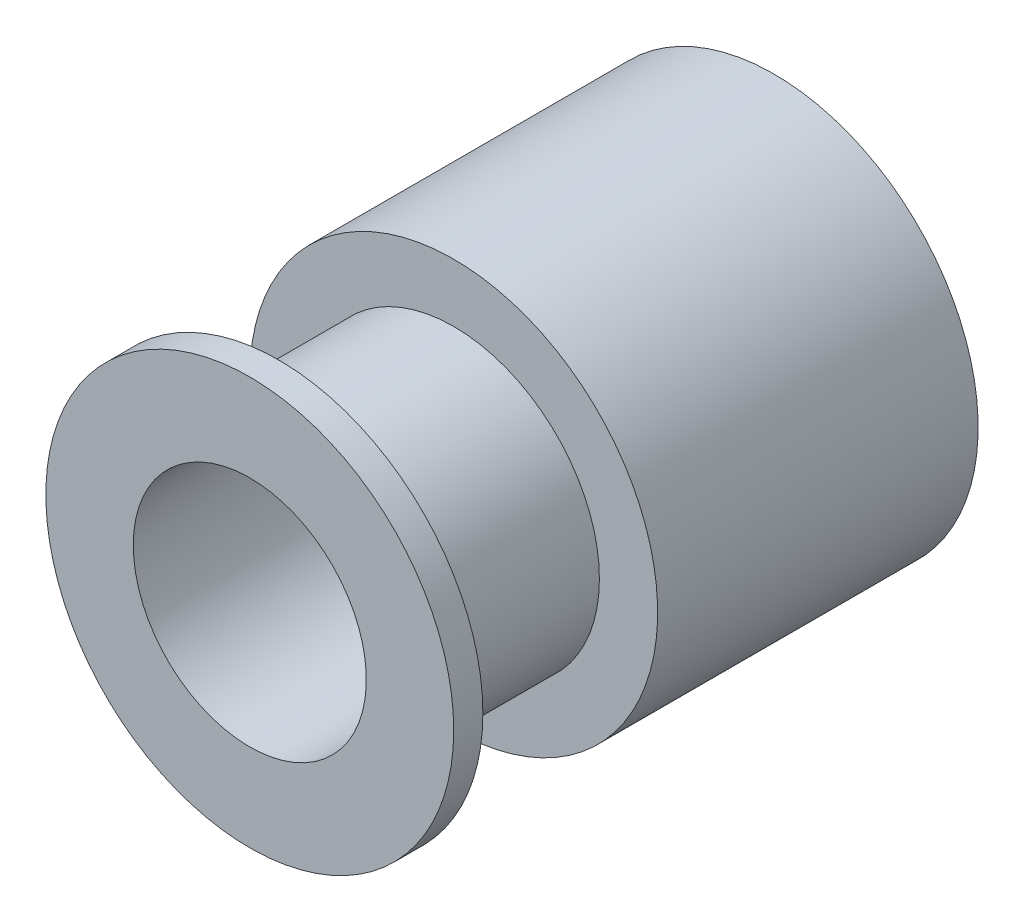
ISO-10303-21;
HEADER;
FILE_DESCRIPTION(('STEP AP214'),'2;1');
FILE_NAME('part.step','',(''),(''),'','','');
FILE_SCHEMA(('AUTOMOTIVE_DESIGN { 1 0 10303 214 1 1 1 1 }'));
ENDSEC;
DATA;
#1=APPLICATION_CONTEXT('core data for automotive mechanical design processes');
#2=APPLICATION_PROTOCOL_DEFINITION('international standard','automotive_design',2000,#1);
#3=PRODUCT_CONTEXT('',#1,'mechanical');
#4=PRODUCT('Part','Part','',(#3));
#5=PRODUCT_RELATED_PRODUCT_CATEGORY('part','',(#4));
#6=PRODUCT_DEFINITION_FORMATION('','',#4);
#7=PRODUCT_DEFINITION_CONTEXT('part definition',#1,'design');
#8=PRODUCT_DEFINITION('design','',#6,#7);
#9=PRODUCT_DEFINITION_SHAPE('','',#8);
#10=(LENGTH_UNIT() NAMED_UNIT(*) SI_UNIT(.MILLI.,.METRE.));
#11=(NAMED_UNIT(*) PLANE_ANGLE_UNIT() SI_UNIT($,.RADIAN.));
#12=(NAMED_UNIT(*) SI_UNIT($,.STERADIAN.) SOLID_ANGLE_UNIT());
#13=UNCERTAINTY_MEASURE_WITH_UNIT(LENGTH_MEASURE(1.E-05),#10,'distance_accuracy_value','');
#14=(GEOMETRIC_REPRESENTATION_CONTEXT(3) GLOBAL_UNCERTAINTY_ASSIGNED_CONTEXT((#13)) GLOBAL_UNIT_ASSIGNED_CONTEXT((#10,
#11,#12)) REPRESENTATION_CONTEXT('',''));
#15=CARTESIAN_POINT('',(0.,0.,0.));
#16=DIRECTION('',(0.,0.,1.));
#17=DIRECTION('',(1.,0.,0.));
#18=AXIS2_PLACEMENT_3D('',#15,#16,#17);
#19=CARTESIAN_POINT('',(0.,0.,1.));
#20=DIRECTION('',(0.,0.,-1.));
#21=DIRECTION('',(-1.,0.,0.));
#22=AXIS2_PLACEMENT_3D('',#19,#20,#21);
#23=CYLINDRICAL_SURFACE('',#22,7.);
#24=CARTESIAN_POINT('',(0.,0.,1.));
#25=DIRECTION('',(0.,0.,1.));
#26=DIRECTION('',(1.,0.,0.));
#27=AXIS2_PLACEMENT_3D('',#24,#25,#26);
#28=CIRCLE('',#27,7.);
#29=CARTESIAN_POINT('',(7.,0.,1.));
#30=VERTEX_POINT('',#29);
#31=EDGE_CURVE('E39',#30,#30,#28,.T.);
#32=ORIENTED_EDGE('',*,*,#31,.F.);
#33=EDGE_LOOP('',(#32));
#34=FACE_BOUND('',#33,.T.);
#35=CARTESIAN_POINT('',(0.,0.,0.));
#36=DIRECTION('',(0.,0.,1.));
#37=DIRECTION('',(1.,0.,0.));
#38=AXIS2_PLACEMENT_3D('',#35,#36,#37);
#39=CIRCLE('',#38,7.);
#40=CARTESIAN_POINT('',(7.,0.,0.));
#41=VERTEX_POINT('',#40);
#42=EDGE_CURVE('E43',#41,#41,#39,.T.);
#43=ORIENTED_EDGE('',*,*,#42,.T.);
#44=EDGE_LOOP('',(#43));
#45=FACE_BOUND('',#44,.T.);
#46=ADVANCED_FACE('F33',(#34,#45),#23,.T.);
#47=CARTESIAN_POINT('',(0.,0.,1.));
#48=DIRECTION('',(0.,0.,1.));
#49=DIRECTION('',(1.,0.,0.));
#50=AXIS2_PLACEMENT_3D('',#47,#48,#49);
#51=PLANE('',#50);
#52=CARTESIAN_POINT('',(0.,0.,1.));
#53=DIRECTION('',(0.,0.,-1.));
#54=DIRECTION('',(-1.,0.,0.));
#55=AXIS2_PLACEMENT_3D('',#52,#53,#54);
#56=CIRCLE('',#55,4.);
#57=CARTESIAN_POINT('',(-4.,0.,1.));
#58=VERTEX_POINT('',#57);
#59=EDGE_CURVE('E56',#58,#58,#56,.T.);
#60=ORIENTED_EDGE('',*,*,#59,.T.);
#61=EDGE_LOOP('',(#60));
#62=FACE_BOUND('',#61,.T.);
#63=ORIENTED_EDGE('',*,*,#31,.T.);
#64=EDGE_LOOP('',(#63));
#65=FACE_BOUND('',#64,.T.);
#66=ADVANCED_FACE('F65',(#62,#65),#51,.T.);
#67=CARTESIAN_POINT('',(0.,0.,0.));
#68=DIRECTION('',(0.,0.,1.));
#69=DIRECTION('',(1.,0.,0.));
#70=AXIS2_PLACEMENT_3D('',#67,#68,#69);
#71=PLANE('',#70);
#72=CARTESIAN_POINT('',(0.,0.,0.));
#73=DIRECTION('',(0.,0.,1.));
#74=DIRECTION('',(1.,0.,0.));
#75=AXIS2_PLACEMENT_3D('',#72,#73,#74);
#76=CIRCLE('',#75,5.);
#77=CARTESIAN_POINT('',(5.,0.,0.));
#78=VERTEX_POINT('',#77);
#79=EDGE_CURVE('E10',#78,#78,#76,.F.);
#80=ORIENTED_EDGE('',*,*,#79,.F.);
#81=EDGE_LOOP('',(#80));
#82=FACE_BOUND('',#81,.T.);
#83=ORIENTED_EDGE('',*,*,#42,.F.);
#84=EDGE_LOOP('',(#83));
#85=FACE_BOUND('',#84,.T.);
#86=ADVANCED_FACE('F97',(#82,#85),#71,.F.);
#87=CARTESIAN_POINT('',(0.,0.,-6.));
#88=DIRECTION('',(0.,0.,1.));
#89=DIRECTION('',(1.,0.,0.));
#90=AXIS2_PLACEMENT_3D('',#87,#88,#89);
#91=CYLINDRICAL_SURFACE('',#90,5.);
#92=CARTESIAN_POINT('',(0.,0.,-6.));
#93=DIRECTION('',(0.,0.,-1.));
#94=DIRECTION('',(-1.,0.,0.));
#95=AXIS2_PLACEMENT_3D('',#92,#93,#94);
#96=CIRCLE('',#95,5.);
#97=CARTESIAN_POINT('',(-5.,0.,-6.));
#98=VERTEX_POINT('',#97);
#99=EDGE_CURVE('E48',#98,#98,#96,.T.);
#100=ORIENTED_EDGE('',*,*,#99,.F.);
#101=EDGE_LOOP('',(#100));
#102=FACE_BOUND('',#101,.T.);
#103=ORIENTED_EDGE('',*,*,#79,.T.);
#104=EDGE_LOOP('',(#103));
#105=FACE_BOUND('',#104,.T.);
#106=ADVANCED_FACE('F83',(#102,#105),#91,.T.);
#107=CARTESIAN_POINT('',(0.,0.,-17.));
#108=DIRECTION('',(0.,0.,1.));
#109=DIRECTION('',(1.,0.,0.));
#110=AXIS2_PLACEMENT_3D('',#107,#108,#109);
#111=CYLINDRICAL_SURFACE('',#110,7.);
#112=CARTESIAN_POINT('',(0.,0.,-17.));
#113=DIRECTION('',(0.,0.,-1.));
#114=DIRECTION('',(-1.,0.,0.));
#115=AXIS2_PLACEMENT_3D('',#112,#113,#114);
#116=CIRCLE('',#115,7.);
#117=CARTESIAN_POINT('',(-7.,0.,-17.));
#118=VERTEX_POINT('',#117);
#119=EDGE_CURVE('E52',#118,#118,#116,.T.);
#120=ORIENTED_EDGE('',*,*,#119,.F.);
#121=EDGE_LOOP('',(#120));
#122=FACE_BOUND('',#121,.T.);
#123=CARTESIAN_POINT('',(0.,0.,-6.));
#124=DIRECTION('',(0.,0.,-1.));
#125=DIRECTION('',(-1.,0.,0.));
#126=AXIS2_PLACEMENT_3D('',#123,#124,#125);
#127=CIRCLE('',#126,7.);
#128=CARTESIAN_POINT('',(-7.,0.,-6.));
#129=VERTEX_POINT('',#128);
#130=EDGE_CURVE('E53',#129,#129,#127,.T.);
#131=ORIENTED_EDGE('',*,*,#130,.T.);
#132=EDGE_LOOP('',(#131));
#133=FACE_BOUND('',#132,.T.);
#134=ADVANCED_FACE('F77',(#122,#133),#111,.T.);
#135=CARTESIAN_POINT('',(0.,0.,-17.));
#136=DIRECTION('',(0.,0.,-1.));
#137=DIRECTION('',(-1.,0.,0.));
#138=AXIS2_PLACEMENT_3D('',#135,#136,#137);
#139=PLANE('',#138);
#140=CARTESIAN_POINT('',(0.,0.,-17.));
#141=DIRECTION('',(0.,0.,-1.));
#142=DIRECTION('',(-1.,0.,0.));
#143=AXIS2_PLACEMENT_3D('',#140,#141,#142);
#144=CIRCLE('',#143,4.);
#145=CARTESIAN_POINT('',(-4.,0.,-17.));
#146=VERTEX_POINT('',#145);
#147=EDGE_CURVE('E59',#146,#146,#144,.T.);
#148=ORIENTED_EDGE('',*,*,#147,.F.);
#149=EDGE_LOOP('',(#148));
#150=FACE_BOUND('',#149,.T.);
#151=ORIENTED_EDGE('',*,*,#119,.T.);
#152=EDGE_LOOP('',(#151));
#153=FACE_BOUND('',#152,.T.);
#154=ADVANCED_FACE('F74',(#150,#153),#139,.T.);
#155=CARTESIAN_POINT('',(0.,0.,-6.));
#156=DIRECTION('',(0.,0.,-1.));
#157=DIRECTION('',(-1.,0.,0.));
#158=AXIS2_PLACEMENT_3D('',#155,#156,#157);
#159=PLANE('',#158);
#160=ORIENTED_EDGE('',*,*,#99,.T.);
#161=EDGE_LOOP('',(#160));
#162=FACE_BOUND('',#161,.T.);
#163=ORIENTED_EDGE('',*,*,#130,.F.);
#164=EDGE_LOOP('',(#163));
#165=FACE_BOUND('',#164,.T.);
#166=ADVANCED_FACE('F70',(#162,#165),#159,.F.);
#167=CARTESIAN_POINT('',(0.,0.,1.));
#168=DIRECTION('',(0.,0.,-1.));
#169=DIRECTION('',(-1.,0.,0.));
#170=AXIS2_PLACEMENT_3D('',#167,#168,#169);
#171=CYLINDRICAL_SURFACE('',#170,4.);
#172=ORIENTED_EDGE('',*,*,#59,.F.);
#173=EDGE_LOOP('',(#172));
#174=FACE_BOUND('',#173,.T.);
#175=ORIENTED_EDGE('',*,*,#147,.T.);
#176=EDGE_LOOP('',(#175));
#177=FACE_BOUND('',#176,.T.);
#178=ADVANCED_FACE('F67',(#174,#177),#171,.F.);
#179=CLOSED_SHELL('',(#46,#66,#86,#106,#134,#154,#166,#178));
#180=MANIFOLD_SOLID_BREP('B2',#179);
#181=ADVANCED_BREP_SHAPE_REPRESENTATION('',(#18,#180),#14);
#182=SHAPE_DEFINITION_REPRESENTATION(#9,#181);
ENDSEC;
END-ISO-10303-21;
